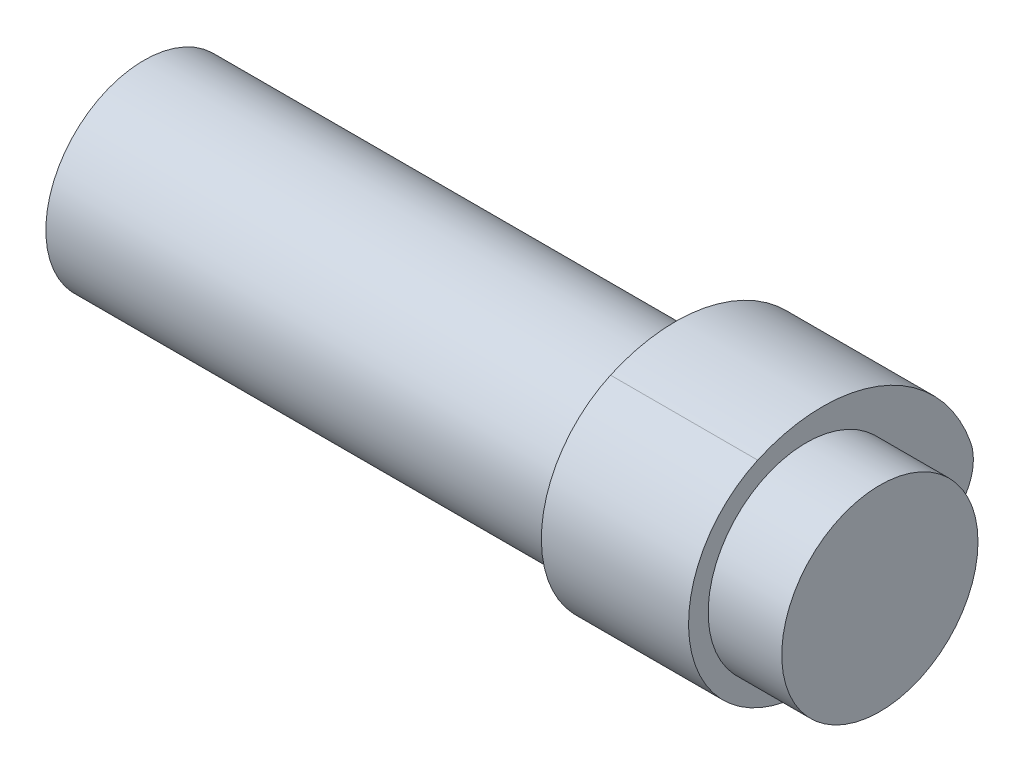
ISO-10303-21;
HEADER;
FILE_DESCRIPTION(('STEP AP214'),'2;1');
FILE_NAME('part.step','',(''),(''),'','','');
FILE_SCHEMA(('AUTOMOTIVE_DESIGN { 1 0 10303 214 1 1 1 1 }'));
ENDSEC;
DATA;
#1=APPLICATION_CONTEXT('core data for automotive mechanical design processes');
#2=APPLICATION_PROTOCOL_DEFINITION('international standard','automotive_design',2000,#1);
#3=PRODUCT_CONTEXT('',#1,'mechanical');
#4=PRODUCT('Part','Part','',(#3));
#5=PRODUCT_RELATED_PRODUCT_CATEGORY('part','',(#4));
#6=PRODUCT_DEFINITION_FORMATION('','',#4);
#7=PRODUCT_DEFINITION_CONTEXT('part definition',#1,'design');
#8=PRODUCT_DEFINITION('design','',#6,#7);
#9=PRODUCT_DEFINITION_SHAPE('','',#8);
#10=(LENGTH_UNIT() NAMED_UNIT(*) SI_UNIT(.MILLI.,.METRE.));
#11=(NAMED_UNIT(*) PLANE_ANGLE_UNIT() SI_UNIT($,.RADIAN.));
#12=(NAMED_UNIT(*) SI_UNIT($,.STERADIAN.) SOLID_ANGLE_UNIT());
#13=UNCERTAINTY_MEASURE_WITH_UNIT(LENGTH_MEASURE(1.E-05),#10,'distance_accuracy_value','');
#14=(GEOMETRIC_REPRESENTATION_CONTEXT(3) GLOBAL_UNCERTAINTY_ASSIGNED_CONTEXT((#13)) GLOBAL_UNIT_ASSIGNED_CONTEXT((#10,
#11,#12)) REPRESENTATION_CONTEXT('',''));
#15=CARTESIAN_POINT('',(0.,0.,0.));
#16=DIRECTION('',(0.,0.,1.));
#17=DIRECTION('',(1.,0.,0.));
#18=AXIS2_PLACEMENT_3D('',#15,#16,#17);
#19=CARTESIAN_POINT('',(0.,0.,0.));
#20=DIRECTION('',(1.,0.,0.));
#21=DIRECTION('',(0.,0.,-1.));
#22=AXIS2_PLACEMENT_3D('',#19,#20,#21);
#23=PLANE('',#22);
#24=CARTESIAN_POINT('',(0.,0.,0.));
#25=DIRECTION('',(1.,0.,0.));
#26=DIRECTION('',(0.,0.,-1.));
#27=AXIS2_PLACEMENT_3D('',#24,#25,#26);
#28=CIRCLE('',#27,10.);
#29=CARTESIAN_POINT('',(0.,0.,-10.));
#30=VERTEX_POINT('',#29);
#31=EDGE_CURVE('E41',#30,#30,#28,.F.);
#32=ORIENTED_EDGE('',*,*,#31,.F.);
#33=EDGE_LOOP('',(#32));
#34=FACE_BOUND('',#33,.T.);
#35=ADVANCED_FACE('F37',(#34),#23,.T.);
#36=CARTESIAN_POINT('',(-75.,0.,0.));
#37=DIRECTION('',(1.,0.,0.));
#38=DIRECTION('',(0.,0.,-1.));
#39=AXIS2_PLACEMENT_3D('',#36,#37,#38);
#40=PLANE('',#39);
#41=CARTESIAN_POINT('',(-75.,0.,0.));
#42=DIRECTION('',(1.,0.,0.));
#43=DIRECTION('',(0.,0.,-1.));
#44=AXIS2_PLACEMENT_3D('',#41,#42,#43);
#45=CIRCLE('',#44,10.);
#46=CARTESIAN_POINT('',(-75.,0.,-10.));
#47=VERTEX_POINT('',#46);
#48=EDGE_CURVE('E137',#47,#47,#45,.T.);
#49=ORIENTED_EDGE('',*,*,#48,.F.);
#50=EDGE_LOOP('',(#49));
#51=FACE_BOUND('',#50,.T.);
#52=ADVANCED_FACE('F125',(#51),#40,.F.);
#53=CARTESIAN_POINT('',(-75.,0.,0.));
#54=DIRECTION('',(1.,0.,0.));
#55=DIRECTION('',(0.,0.,-1.));
#56=AXIS2_PLACEMENT_3D('',#53,#54,#55);
#57=CYLINDRICAL_SURFACE('',#56,10.);
#58=ORIENTED_EDGE('',*,*,#48,.T.);
#59=EDGE_LOOP('',(#58));
#60=FACE_BOUND('',#59,.T.);
#61=CARTESIAN_POINT('',(-22.5,0.,0.));
#62=DIRECTION('',(1.,0.,0.));
#63=DIRECTION('',(0.,0.,-1.));
#64=AXIS2_PLACEMENT_3D('',#61,#62,#63);
#65=CIRCLE('',#64,10.);
#66=CARTESIAN_POINT('',(-22.5,0.,-10.));
#67=VERTEX_POINT('',#66);
#68=EDGE_CURVE('E138',#67,#67,#65,.F.);
#69=ORIENTED_EDGE('',*,*,#68,.T.);
#70=EDGE_LOOP('',(#69));
#71=FACE_BOUND('',#70,.T.);
#72=ADVANCED_FACE('F127',(#60,#71),#57,.T.);
#73=CARTESIAN_POINT('',(-22.5,-1.82185343142505,-6.83976699708438));
#74=DIRECTION('',(1.,0.,0.));
#75=DIRECTION('',(0.,0.,1.));
#76=AXIS2_PLACEMENT_3D('',#73,#74,#75);
#77=PLANE('',#76);
#78=ORIENTED_EDGE('',*,*,#68,.F.);
#79=EDGE_LOOP('',(#78));
#80=FACE_BOUND('',#79,.T.);
#81=CARTESIAN_POINT('',(-22.5,-3.64370686285011,-1.65027279490969));
#82=DIRECTION('',(1.,0.,0.));
#83=DIRECTION('',(0.,0.,1.));
#84=AXIS2_PLACEMENT_3D('',#81,#82,#83);
#85=CIRCLE('',#84,16.);
#86=CARTESIAN_POINT('',(-22.5,1.65623039220459,-16.7469832012361));
#87=VERTEX_POINT('',#86);
#88=CARTESIAN_POINT('',(-22.5,10.9311205885503,4.95081838472907));
#89=VERTEX_POINT('',#88);
#90=EDGE_CURVE('E101',#87,#89,#85,.T.);
#91=ORIENTED_EDGE('',*,*,#90,.F.);
#92=CARTESIAN_POINT('',(-22.5,0.,-12.0292611992591));
#93=DIRECTION('',(1.,0.,0.));
#94=DIRECTION('',(0.,0.,1.));
#95=AXIS2_PLACEMENT_3D('',#92,#93,#94);
#96=CIRCLE('',#95,5.);
#97=CARTESIAN_POINT('',(-22.5,-3.59229395969443,-15.5071088248952));
#98=VERTEX_POINT('',#97);
#99=EDGE_CURVE('E103',#98,#87,#96,.T.);
#100=ORIENTED_EDGE('',*,*,#99,.F.);
#101=CARTESIAN_POINT('',(-22.5,25.1460577178611,12.3156721801938));
#102=DIRECTION('',(1.,0.,0.));
#103=DIRECTION('',(0.,0.,1.));
#104=AXIS2_PLACEMENT_3D('',#101,#102,#103);
#105=CIRCLE('',#104,40.);
#106=CARTESIAN_POINT('',(-22.5,-10.7768818790833,-5.27814522008306));
#107=VERTEX_POINT('',#106);
#108=EDGE_CURVE('E108',#107,#98,#105,.T.);
#109=ORIENTED_EDGE('',*,*,#108,.F.);
#110=CARTESIAN_POINT('',(-22.5,0.,0.));
#111=DIRECTION('',(1.,0.,0.));
#112=DIRECTION('',(0.,0.,-1.));
#113=AXIS2_PLACEMENT_3D('',#110,#111,#112);
#114=CIRCLE('',#113,12.);
#115=EDGE_CURVE('E89',#89,#107,#114,.T.);
#116=ORIENTED_EDGE('',*,*,#115,.F.);
#117=EDGE_LOOP('',(#91,#100,#109,#116));
#118=FACE_BOUND('',#117,.T.);
#119=ADVANCED_FACE('F112',(#80,#118),#77,.F.);
#120=CARTESIAN_POINT('',(-22.5,0.,-12.0292611992591));
#121=DIRECTION('',(1.,0.,0.));
#122=DIRECTION('',(0.,0.,-1.));
#123=AXIS2_PLACEMENT_3D('',#120,#121,#122);
#124=CYLINDRICAL_SURFACE('',#123,5.);
#125=CARTESIAN_POINT('',(-7.5,0.,-12.0292611992591));
#126=DIRECTION('',(1.,0.,0.));
#127=DIRECTION('',(0.,0.,1.));
#128=AXIS2_PLACEMENT_3D('',#125,#126,#127);
#129=CIRCLE('',#128,5.);
#130=CARTESIAN_POINT('',(-7.5,-3.59229395969443,-15.5071088248952));
#131=VERTEX_POINT('',#130);
#132=CARTESIAN_POINT('',(-7.5,1.65623039220459,-16.7469832012361));
#133=VERTEX_POINT('',#132);
#134=EDGE_CURVE('E47',#131,#133,#129,.T.);
#135=ORIENTED_EDGE('',*,*,#134,.F.);
#136=DIRECTION('',(1.,0.,0.));
#137=VECTOR('',#136,1.);
#138=CARTESIAN_POINT('',(-22.5,-3.59229395969443,-15.5071088248952));
#139=LINE('',#138,#137);
#140=EDGE_CURVE('E70',#98,#131,#139,.T.);
#141=ORIENTED_EDGE('',*,*,#140,.F.);
#142=ORIENTED_EDGE('',*,*,#99,.T.);
#143=DIRECTION('',(1.,0.,0.));
#144=VECTOR('',#143,1.);
#145=CARTESIAN_POINT('',(-22.5,1.65623039220459,-16.7469832012361));
#146=LINE('',#145,#144);
#147=EDGE_CURVE('E56',#87,#133,#146,.T.);
#148=ORIENTED_EDGE('',*,*,#147,.T.);
#149=EDGE_LOOP('',(#135,#141,#142,#148));
#150=FACE_BOUND('',#149,.T.);
#151=ADVANCED_FACE('F110',(#150),#124,.T.);
#152=CARTESIAN_POINT('',(-22.5,25.1460577178611,12.3156721801938));
#153=DIRECTION('',(1.,0.,0.));
#154=DIRECTION('',(0.,0.,-1.));
#155=AXIS2_PLACEMENT_3D('',#152,#153,#154);
#156=CYLINDRICAL_SURFACE('',#155,40.);
#157=CARTESIAN_POINT('',(-7.5,25.1460577178611,12.3156721801938));
#158=DIRECTION('',(1.,0.,0.));
#159=DIRECTION('',(0.,0.,1.));
#160=AXIS2_PLACEMENT_3D('',#157,#158,#159);
#161=CIRCLE('',#160,40.);
#162=CARTESIAN_POINT('',(-7.5,-10.7768818790833,-5.27814522008306));
#163=VERTEX_POINT('',#162);
#164=EDGE_CURVE('E95',#163,#131,#161,.T.);
#165=ORIENTED_EDGE('',*,*,#164,.F.);
#166=DIRECTION('',(1.,0.,0.));
#167=VECTOR('',#166,1.);
#168=CARTESIAN_POINT('',(-22.5,-10.7768818790833,-5.27814522008306));
#169=LINE('',#168,#167);
#170=EDGE_CURVE('E83',#107,#163,#169,.T.);
#171=ORIENTED_EDGE('',*,*,#170,.F.);
#172=ORIENTED_EDGE('',*,*,#108,.T.);
#173=ORIENTED_EDGE('',*,*,#140,.T.);
#174=EDGE_LOOP('',(#165,#171,#172,#173));
#175=FACE_BOUND('',#174,.T.);
#176=ADVANCED_FACE('F96',(#175),#156,.T.);
#177=CARTESIAN_POINT('',(-22.5,0.,0.));
#178=DIRECTION('',(1.,0.,0.));
#179=DIRECTION('',(0.,0.,-1.));
#180=AXIS2_PLACEMENT_3D('',#177,#178,#179);
#181=CYLINDRICAL_SURFACE('',#180,12.);
#182=CARTESIAN_POINT('',(-7.5,0.,0.));
#183=DIRECTION('',(1.,0.,0.));
#184=DIRECTION('',(0.,0.,-1.));
#185=AXIS2_PLACEMENT_3D('',#182,#183,#184);
#186=CIRCLE('',#185,12.);
#187=CARTESIAN_POINT('',(-7.5,10.9311205885503,4.95081838472907));
#188=VERTEX_POINT('',#187);
#189=EDGE_CURVE('E87',#188,#163,#186,.T.);
#190=ORIENTED_EDGE('',*,*,#189,.F.);
#191=DIRECTION('',(1.,0.,0.));
#192=VECTOR('',#191,1.);
#193=CARTESIAN_POINT('',(-22.5,10.9311205885503,4.95081838472907));
#194=LINE('',#193,#192);
#195=EDGE_CURVE('E78',#89,#188,#194,.T.);
#196=ORIENTED_EDGE('',*,*,#195,.F.);
#197=ORIENTED_EDGE('',*,*,#115,.T.);
#198=ORIENTED_EDGE('',*,*,#170,.T.);
#199=EDGE_LOOP('',(#190,#196,#197,#198));
#200=FACE_BOUND('',#199,.T.);
#201=ADVANCED_FACE('F85',(#200),#181,.T.);
#202=CARTESIAN_POINT('',(-22.5,-3.64370686285011,-1.65027279490969));
#203=DIRECTION('',(1.,0.,0.));
#204=DIRECTION('',(0.,0.,-1.));
#205=AXIS2_PLACEMENT_3D('',#202,#203,#204);
#206=CYLINDRICAL_SURFACE('',#205,16.);
#207=CARTESIAN_POINT('',(-7.5,-3.64370686285011,-1.65027279490969));
#208=DIRECTION('',(1.,0.,0.));
#209=DIRECTION('',(0.,0.,1.));
#210=AXIS2_PLACEMENT_3D('',#207,#208,#209);
#211=CIRCLE('',#210,16.);
#212=EDGE_CURVE('E11',#133,#188,#211,.T.);
#213=ORIENTED_EDGE('',*,*,#212,.F.);
#214=ORIENTED_EDGE('',*,*,#147,.F.);
#215=ORIENTED_EDGE('',*,*,#90,.T.);
#216=ORIENTED_EDGE('',*,*,#195,.T.);
#217=EDGE_LOOP('',(#213,#214,#215,#216));
#218=FACE_BOUND('',#217,.T.);
#219=ADVANCED_FACE('F113',(#218),#206,.T.);
#220=CARTESIAN_POINT('',(-7.5,-1.82185343142505,-6.83976699708438));
#221=DIRECTION('',(1.,0.,0.));
#222=DIRECTION('',(0.,0.,1.));
#223=AXIS2_PLACEMENT_3D('',#220,#221,#222);
#224=PLANE('',#223);
#225=CARTESIAN_POINT('',(-7.49999999999999,0.,0.));
#226=DIRECTION('',(1.,0.,0.));
#227=DIRECTION('',(0.,0.,-1.));
#228=AXIS2_PLACEMENT_3D('',#225,#226,#227);
#229=CIRCLE('',#228,10.);
#230=CARTESIAN_POINT('',(-7.49999999999999,0.,-10.));
#231=VERTEX_POINT('',#230);
#232=EDGE_CURVE('E139',#231,#231,#229,.F.);
#233=ORIENTED_EDGE('',*,*,#232,.T.);
#234=EDGE_LOOP('',(#233));
#235=FACE_BOUND('',#234,.T.);
#236=ORIENTED_EDGE('',*,*,#212,.T.);
#237=ORIENTED_EDGE('',*,*,#189,.T.);
#238=ORIENTED_EDGE('',*,*,#164,.T.);
#239=ORIENTED_EDGE('',*,*,#134,.T.);
#240=EDGE_LOOP('',(#236,#237,#238,#239));
#241=FACE_BOUND('',#240,.T.);
#242=ADVANCED_FACE('F100',(#235,#241),#224,.T.);
#243=ORIENTED_EDGE('',*,*,#232,.F.);
#244=EDGE_LOOP('',(#243));
#245=FACE_BOUND('',#244,.T.);
#246=ORIENTED_EDGE('',*,*,#31,.T.);
#247=EDGE_LOOP('',(#246));
#248=FACE_BOUND('',#247,.T.);
#249=ADVANCED_FACE('F39',(#245,#248),#57,.T.);
#250=CLOSED_SHELL('',(#35,#52,#72,#119,#151,#176,#201,#219,#242,#249));
#251=MANIFOLD_SOLID_BREP('B2',#250);
#252=ADVANCED_BREP_SHAPE_REPRESENTATION('',(#18,#251),#14);
#253=SHAPE_DEFINITION_REPRESENTATION(#9,#252);
ENDSEC;
END-ISO-10303-21;
